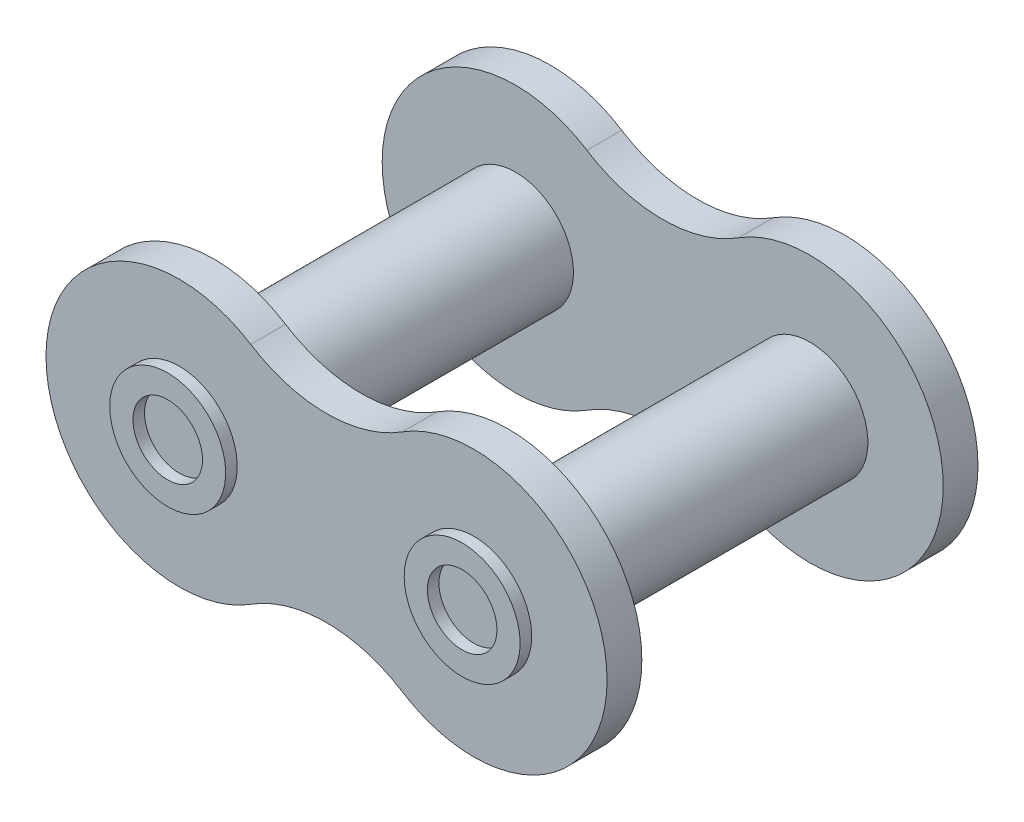
ISO-10303-21;
HEADER;
FILE_DESCRIPTION(('STEP AP214'),'2;1');
FILE_NAME('part.step','',(''),(''),'','','');
FILE_SCHEMA(('AUTOMOTIVE_DESIGN { 1 0 10303 214 1 1 1 1 }'));
ENDSEC;
DATA;
#1=APPLICATION_CONTEXT('core data for automotive mechanical design processes');
#2=APPLICATION_PROTOCOL_DEFINITION('international standard','automotive_design',2000,#1);
#3=PRODUCT_CONTEXT('',#1,'mechanical');
#4=PRODUCT('Part','Part','',(#3));
#5=PRODUCT_RELATED_PRODUCT_CATEGORY('part','',(#4));
#6=PRODUCT_DEFINITION_FORMATION('','',#4);
#7=PRODUCT_DEFINITION_CONTEXT('part definition',#1,'design');
#8=PRODUCT_DEFINITION('design','',#6,#7);
#9=PRODUCT_DEFINITION_SHAPE('','',#8);
#10=(LENGTH_UNIT() NAMED_UNIT(*) SI_UNIT(.MILLI.,.METRE.));
#11=(NAMED_UNIT(*) PLANE_ANGLE_UNIT() SI_UNIT($,.RADIAN.));
#12=(NAMED_UNIT(*) SI_UNIT($,.STERADIAN.) SOLID_ANGLE_UNIT());
#13=UNCERTAINTY_MEASURE_WITH_UNIT(LENGTH_MEASURE(1.E-05),#10,'distance_accuracy_value','');
#14=(GEOMETRIC_REPRESENTATION_CONTEXT(3) GLOBAL_UNCERTAINTY_ASSIGNED_CONTEXT((#13)) GLOBAL_UNIT_ASSIGNED_CONTEXT((#10,
#11,#12)) REPRESENTATION_CONTEXT('',''));
#15=CARTESIAN_POINT('',(0.,0.,0.));
#16=DIRECTION('',(0.,0.,1.));
#17=DIRECTION('',(1.,0.,0.));
#18=AXIS2_PLACEMENT_3D('',#15,#16,#17);
#19=CARTESIAN_POINT('',(3.175,5.,-8.));
#20=DIRECTION('',(0.,0.,1.));
#21=DIRECTION('',(1.,0.,0.));
#22=AXIS2_PLACEMENT_3D('',#19,#20,#21);
#23=PLANE('',#22);
#24=CARTESIAN_POINT('',(6.35,0.,-8.));
#25=DIRECTION('',(0.,0.,1.));
#26=DIRECTION('',(1.,0.,0.));
#27=AXIS2_PLACEMENT_3D('',#24,#25,#26);
#28=CIRCLE('',#27,2.5);
#29=CARTESIAN_POINT('',(8.85,0.,-8.));
#30=VERTEX_POINT('',#29);
#31=EDGE_CURVE('E271',#30,#30,#28,.T.);
#32=ORIENTED_EDGE('',*,*,#31,.T.);
#33=EDGE_LOOP('',(#32));
#34=FACE_BOUND('',#33,.T.);
#35=CARTESIAN_POINT('',(0.,10.,-8.));
#36=DIRECTION('',(0.,0.,1.));
#37=DIRECTION('',(1.,0.,0.));
#38=AXIS2_PLACEMENT_3D('',#35,#36,#37);
#39=CIRCLE('',#38,6.09577983925077);
#40=CARTESIAN_POINT('',(-3.26767865894177,4.85404935599722,-8.));
#41=VERTEX_POINT('',#40);
#42=CARTESIAN_POINT('',(3.26767865894177,4.85404935599722,-8.));
#43=VERTEX_POINT('',#42);
#44=EDGE_CURVE('E165',#41,#43,#39,.T.);
#45=ORIENTED_EDGE('',*,*,#44,.T.);
#46=CARTESIAN_POINT('',(6.35,0.,-8.));
#47=DIRECTION('',(0.,0.,-1.));
#48=DIRECTION('',(-1.,0.,0.));
#49=AXIS2_PLACEMENT_3D('',#46,#47,#48);
#50=CIRCLE('',#49,5.75);
#51=CARTESIAN_POINT('',(3.26767865894177,-4.85404935599722,-8.));
#52=VERTEX_POINT('',#51);
#53=EDGE_CURVE('E83',#43,#52,#50,.T.);
#54=ORIENTED_EDGE('',*,*,#53,.T.);
#55=CARTESIAN_POINT('',(0.,-10.,-8.));
#56=DIRECTION('',(0.,0.,-1.));
#57=DIRECTION('',(-1.,0.,0.));
#58=AXIS2_PLACEMENT_3D('',#55,#56,#57);
#59=CIRCLE('',#58,6.09577983925077);
#60=CARTESIAN_POINT('',(-3.26767865894177,-4.85404935599722,-8.));
#61=VERTEX_POINT('',#60);
#62=EDGE_CURVE('E169',#61,#52,#59,.T.);
#63=ORIENTED_EDGE('',*,*,#62,.F.);
#64=CARTESIAN_POINT('',(-6.35,0.,-8.));
#65=DIRECTION('',(0.,0.,1.));
#66=DIRECTION('',(1.,0.,0.));
#67=AXIS2_PLACEMENT_3D('',#64,#65,#66);
#68=CIRCLE('',#67,5.75);
#69=EDGE_CURVE('E172',#41,#61,#68,.T.);
#70=ORIENTED_EDGE('',*,*,#69,.F.);
#71=EDGE_LOOP('',(#45,#54,#63,#70));
#72=FACE_BOUND('',#71,.T.);
#73=CARTESIAN_POINT('',(-6.35,0.,-8.));
#74=DIRECTION('',(0.,0.,1.));
#75=DIRECTION('',(1.,0.,0.));
#76=AXIS2_PLACEMENT_3D('',#73,#74,#75);
#77=CIRCLE('',#76,2.5);
#78=CARTESIAN_POINT('',(-3.85,0.,-8.));
#79=VERTEX_POINT('',#78);
#80=EDGE_CURVE('E12',#79,#79,#77,.F.);
#81=ORIENTED_EDGE('',*,*,#80,.F.);
#82=EDGE_LOOP('',(#81));
#83=FACE_BOUND('',#82,.T.);
#84=ADVANCED_FACE('F38',(#34,#72,#83),#23,.F.);
#85=CARTESIAN_POINT('',(3.175,5.,8.));
#86=DIRECTION('',(0.,0.,-1.));
#87=DIRECTION('',(1.,0.,0.));
#88=AXIS2_PLACEMENT_3D('',#85,#86,#87);
#89=PLANE('',#88);
#90=CARTESIAN_POINT('',(6.35,0.,8.));
#91=DIRECTION('',(0.,0.,-1.));
#92=DIRECTION('',(-1.,0.,0.));
#93=AXIS2_PLACEMENT_3D('',#90,#91,#92);
#94=CIRCLE('',#93,2.5);
#95=CARTESIAN_POINT('',(3.85,0.,8.));
#96=VERTEX_POINT('',#95);
#97=EDGE_CURVE('E275',#96,#96,#94,.T.);
#98=ORIENTED_EDGE('',*,*,#97,.T.);
#99=EDGE_LOOP('',(#98));
#100=FACE_BOUND('',#99,.T.);
#101=CARTESIAN_POINT('',(0.,10.,8.));
#102=DIRECTION('',(0.,0.,1.));
#103=DIRECTION('',(1.,0.,0.));
#104=AXIS2_PLACEMENT_3D('',#101,#102,#103);
#105=CIRCLE('',#104,6.09577983925077);
#106=CARTESIAN_POINT('',(-3.26767865894177,4.85404935599722,8.));
#107=VERTEX_POINT('',#106);
#108=CARTESIAN_POINT('',(3.26767865894177,4.85404935599722,8.));
#109=VERTEX_POINT('',#108);
#110=EDGE_CURVE('E115',#107,#109,#105,.T.);
#111=ORIENTED_EDGE('',*,*,#110,.F.);
#112=CARTESIAN_POINT('',(-6.35,0.,8.));
#113=DIRECTION('',(0.,0.,1.));
#114=DIRECTION('',(1.,0.,0.));
#115=AXIS2_PLACEMENT_3D('',#112,#113,#114);
#116=CIRCLE('',#115,5.75);
#117=CARTESIAN_POINT('',(-3.26767865894177,-4.85404935599722,8.));
#118=VERTEX_POINT('',#117);
#119=EDGE_CURVE('E125',#107,#118,#116,.T.);
#120=ORIENTED_EDGE('',*,*,#119,.T.);
#121=CARTESIAN_POINT('',(0.,-10.,8.));
#122=DIRECTION('',(0.,0.,-1.));
#123=DIRECTION('',(-1.,0.,0.));
#124=AXIS2_PLACEMENT_3D('',#121,#122,#123);
#125=CIRCLE('',#124,6.09577983925077);
#126=CARTESIAN_POINT('',(3.26767865894177,-4.85404935599722,8.));
#127=VERTEX_POINT('',#126);
#128=EDGE_CURVE('E130',#118,#127,#125,.T.);
#129=ORIENTED_EDGE('',*,*,#128,.T.);
#130=CARTESIAN_POINT('',(6.35,0.,8.));
#131=DIRECTION('',(0.,0.,-1.));
#132=DIRECTION('',(-1.,0.,0.));
#133=AXIS2_PLACEMENT_3D('',#130,#131,#132);
#134=CIRCLE('',#133,5.75);
#135=EDGE_CURVE('E135',#109,#127,#134,.T.);
#136=ORIENTED_EDGE('',*,*,#135,.F.);
#137=EDGE_LOOP('',(#111,#120,#129,#136));
#138=FACE_BOUND('',#137,.T.);
#139=CARTESIAN_POINT('',(-6.35,0.,8.));
#140=DIRECTION('',(0.,0.,-1.));
#141=DIRECTION('',(-1.,0.,0.));
#142=AXIS2_PLACEMENT_3D('',#139,#140,#141);
#143=CIRCLE('',#142,2.5);
#144=CARTESIAN_POINT('',(-8.85,0.,8.));
#145=VERTEX_POINT('',#144);
#146=EDGE_CURVE('E42',#145,#145,#143,.F.);
#147=ORIENTED_EDGE('',*,*,#146,.F.);
#148=EDGE_LOOP('',(#147));
#149=FACE_BOUND('',#148,.T.);
#150=ADVANCED_FACE('F132',(#100,#138,#149),#89,.F.);
#151=CARTESIAN_POINT('',(3.175,5.,-6.5));
#152=DIRECTION('',(0.,0.,1.));
#153=DIRECTION('',(1.,0.,0.));
#154=AXIS2_PLACEMENT_3D('',#151,#152,#153);
#155=PLANE('',#154);
#156=CARTESIAN_POINT('',(0.,10.,-6.5));
#157=DIRECTION('',(0.,0.,1.));
#158=DIRECTION('',(1.,0.,0.));
#159=AXIS2_PLACEMENT_3D('',#156,#157,#158);
#160=CIRCLE('',#159,6.09577983925077);
#161=CARTESIAN_POINT('',(-3.26767865894177,4.85404935599722,-6.5));
#162=VERTEX_POINT('',#161);
#163=CARTESIAN_POINT('',(3.26767865894177,4.85404935599722,-6.5));
#164=VERTEX_POINT('',#163);
#165=EDGE_CURVE('E162',#162,#164,#160,.T.);
#166=ORIENTED_EDGE('',*,*,#165,.F.);
#167=CARTESIAN_POINT('',(-6.35,0.,-6.5));
#168=DIRECTION('',(0.,0.,1.));
#169=DIRECTION('',(1.,0.,0.));
#170=AXIS2_PLACEMENT_3D('',#167,#168,#169);
#171=CIRCLE('',#170,5.75);
#172=CARTESIAN_POINT('',(-3.26767865894177,-4.85404935599722,-6.5));
#173=VERTEX_POINT('',#172);
#174=EDGE_CURVE('E167',#162,#173,#171,.T.);
#175=ORIENTED_EDGE('',*,*,#174,.T.);
#176=CARTESIAN_POINT('',(0.,-10.,-6.5));
#177=DIRECTION('',(0.,0.,-1.));
#178=DIRECTION('',(-1.,0.,0.));
#179=AXIS2_PLACEMENT_3D('',#176,#177,#178);
#180=CIRCLE('',#179,6.09577983925077);
#181=CARTESIAN_POINT('',(3.26767865894177,-4.85404935599722,-6.5));
#182=VERTEX_POINT('',#181);
#183=EDGE_CURVE('E178',#173,#182,#180,.T.);
#184=ORIENTED_EDGE('',*,*,#183,.T.);
#185=CARTESIAN_POINT('',(6.35,0.,-6.5));
#186=DIRECTION('',(0.,0.,-1.));
#187=DIRECTION('',(-1.,0.,0.));
#188=AXIS2_PLACEMENT_3D('',#185,#186,#187);
#189=CIRCLE('',#188,5.75);
#190=EDGE_CURVE('E175',#164,#182,#189,.T.);
#191=ORIENTED_EDGE('',*,*,#190,.F.);
#192=EDGE_LOOP('',(#166,#175,#184,#191));
#193=FACE_BOUND('',#192,.T.);
#194=CARTESIAN_POINT('',(6.35,0.,-6.5));
#195=DIRECTION('',(0.,0.,1.));
#196=DIRECTION('',(1.,0.,0.));
#197=AXIS2_PLACEMENT_3D('',#194,#195,#196);
#198=CIRCLE('',#197,2.5);
#199=CARTESIAN_POINT('',(3.85,0.,-6.5));
#200=VERTEX_POINT('',#199);
#201=EDGE_CURVE('E188',#200,#200,#198,.F.);
#202=ORIENTED_EDGE('',*,*,#201,.T.);
#203=EDGE_LOOP('',(#202));
#204=FACE_BOUND('',#203,.T.);
#205=CARTESIAN_POINT('',(-6.35,0.,-6.5));
#206=DIRECTION('',(0.,0.,1.));
#207=DIRECTION('',(1.,0.,0.));
#208=AXIS2_PLACEMENT_3D('',#205,#206,#207);
#209=CIRCLE('',#208,2.5);
#210=CARTESIAN_POINT('',(-8.85,0.,-6.5));
#211=VERTEX_POINT('',#210);
#212=EDGE_CURVE('E159',#211,#211,#209,.T.);
#213=ORIENTED_EDGE('',*,*,#212,.F.);
#214=EDGE_LOOP('',(#213));
#215=FACE_BOUND('',#214,.T.);
#216=ADVANCED_FACE('F197',(#193,#204,#215),#155,.T.);
#217=CARTESIAN_POINT('',(6.35,0.,6.5));
#218=DIRECTION('',(0.,0.,-1.));
#219=DIRECTION('',(-1.,0.,0.));
#220=AXIS2_PLACEMENT_3D('',#217,#218,#219);
#221=CYLINDRICAL_SURFACE('',#220,2.5);
#222=CARTESIAN_POINT('',(6.35,0.,6.5));
#223=DIRECTION('',(0.,0.,-1.));
#224=DIRECTION('',(-1.,0.,0.));
#225=AXIS2_PLACEMENT_3D('',#222,#223,#224);
#226=CIRCLE('',#225,2.5);
#227=CARTESIAN_POINT('',(3.85,0.,6.5));
#228=VERTEX_POINT('',#227);
#229=EDGE_CURVE('E121',#228,#228,#226,.F.);
#230=CARTESIAN_POINT('',(3.85,0.,6.5));
#231=CARTESIAN_POINT('',(3.85,0.,6.36458333333333));
#232=CARTESIAN_POINT('',(3.85,0.,6.22916666666667));
#233=CARTESIAN_POINT('',(3.85,0.,5.95833333333333));
#234=CARTESIAN_POINT('',(3.85,0.,5.82291666666667));
#235=CARTESIAN_POINT('',(3.85,0.,5.55208333333333));
#236=CARTESIAN_POINT('',(3.85,0.,5.41666666666667));
#237=CARTESIAN_POINT('',(3.85,0.,5.14583333333333));
#238=CARTESIAN_POINT('',(3.85,0.,5.01041666666667));
#239=CARTESIAN_POINT('',(3.85,0.,4.73958333333333));
#240=CARTESIAN_POINT('',(3.85,0.,4.60416666666667));
#241=CARTESIAN_POINT('',(3.85,0.,4.33333333333333));
#242=CARTESIAN_POINT('',(3.85,0.,4.19791666666667));
#243=CARTESIAN_POINT('',(3.85,0.,3.92708333333333));
#244=CARTESIAN_POINT('',(3.85,0.,3.79166666666667));
#245=CARTESIAN_POINT('',(3.85,0.,3.52083333333333));
#246=CARTESIAN_POINT('',(3.85,0.,3.38541666666667));
#247=CARTESIAN_POINT('',(3.85,0.,3.11458333333333));
#248=CARTESIAN_POINT('',(3.85,0.,2.97916666666667));
#249=CARTESIAN_POINT('',(3.85,0.,2.70833333333333));
#250=CARTESIAN_POINT('',(3.85,0.,2.57291666666667));
#251=CARTESIAN_POINT('',(3.85,0.,2.30208333333333));
#252=CARTESIAN_POINT('',(3.85,0.,2.16666666666667));
#253=CARTESIAN_POINT('',(3.85,0.,1.89583333333333));
#254=CARTESIAN_POINT('',(3.85,0.,1.76041666666667));
#255=CARTESIAN_POINT('',(3.85,0.,1.48958333333333));
#256=CARTESIAN_POINT('',(3.85,0.,1.35416666666667));
#257=CARTESIAN_POINT('',(3.85,0.,1.08333333333333));
#258=CARTESIAN_POINT('',(3.85,0.,0.947916666666668));
#259=CARTESIAN_POINT('',(3.85,0.,0.677083333333334));
#260=CARTESIAN_POINT('',(3.85,0.,0.541666666666668));
#261=CARTESIAN_POINT('',(3.85,0.,0.270833333333334));
#262=CARTESIAN_POINT('',(3.85,0.,0.135416666666668));
#263=CARTESIAN_POINT('',(3.85,0.,-0.135416666666666));
#264=CARTESIAN_POINT('',(3.85,0.,-0.270833333333333));
#265=CARTESIAN_POINT('',(3.85,0.,-0.541666666666666));
#266=CARTESIAN_POINT('',(3.85,0.,-0.677083333333332));
#267=CARTESIAN_POINT('',(3.85,0.,-0.947916666666666));
#268=CARTESIAN_POINT('',(3.85,0.,-1.08333333333333));
#269=CARTESIAN_POINT('',(3.85,0.,-1.35416666666667));
#270=CARTESIAN_POINT('',(3.85,0.,-1.48958333333333));
#271=CARTESIAN_POINT('',(3.85,0.,-1.76041666666667));
#272=CARTESIAN_POINT('',(3.85,0.,-1.89583333333333));
#273=CARTESIAN_POINT('',(3.85,0.,-2.16666666666667));
#274=CARTESIAN_POINT('',(3.85,0.,-2.30208333333333));
#275=CARTESIAN_POINT('',(3.85,0.,-2.57291666666667));
#276=CARTESIAN_POINT('',(3.85,0.,-2.70833333333333));
#277=CARTESIAN_POINT('',(3.85,0.,-2.97916666666667));
#278=CARTESIAN_POINT('',(3.85,0.,-3.11458333333333));
#279=CARTESIAN_POINT('',(3.85,0.,-3.38541666666667));
#280=CARTESIAN_POINT('',(3.85,0.,-3.52083333333333));
#281=CARTESIAN_POINT('',(3.85,0.,-3.79166666666667));
#282=CARTESIAN_POINT('',(3.85,0.,-3.92708333333333));
#283=CARTESIAN_POINT('',(3.85,0.,-4.19791666666667));
#284=CARTESIAN_POINT('',(3.85,0.,-4.33333333333333));
#285=CARTESIAN_POINT('',(3.85,0.,-4.60416666666667));
#286=CARTESIAN_POINT('',(3.85,0.,-4.73958333333333));
#287=CARTESIAN_POINT('',(3.85,0.,-5.01041666666667));
#288=CARTESIAN_POINT('',(3.85,0.,-5.14583333333333));
#289=CARTESIAN_POINT('',(3.85,0.,-5.41666666666667));
#290=CARTESIAN_POINT('',(3.85,0.,-5.55208333333333));
#291=CARTESIAN_POINT('',(3.85,0.,-5.82291666666667));
#292=CARTESIAN_POINT('',(3.85,0.,-5.95833333333333));
#293=CARTESIAN_POINT('',(3.85,0.,-6.22916666666667));
#294=CARTESIAN_POINT('',(3.85,0.,-6.36458333333333));
#295=CARTESIAN_POINT('',(3.85,0.,-6.5));
#296=B_SPLINE_CURVE_WITH_KNOTS('',3,(#230,#231,#232,#233,#234,#235,#236,#237,#238,#239,#240,
#241,#242,#243,#244,#245,#246,#247,#248,#249,#250,#251,#252,#253,#254,#255,#256,#257,#258,#259,
#260,#261,#262,#263,#264,#265,#266,#267,#268,#269,#270,#271,#272,#273,#274,#275,#276,#277,#278,
#279,#280,#281,#282,#283,#284,#285,#286,#287,#288,#289,#290,#291,#292,#293,#294,#295),
.UNSPECIFIED.,.F.,.F.,(4,2,2,2,2,2,2,2,2,2,2,2,2,2,2,2,2,2,2,2,2,2,2,2,2,2,2,2,2,2,2,2,4),(0.,
0.40625,0.812500000000001,1.21875,1.625,2.03125,2.4375,2.84375,3.25,3.65625,4.0625,4.46875,
4.875,5.28125,5.6875,6.09375,6.5,6.90625,7.3125,7.71875,8.125,8.53125,8.9375,9.34375,9.75,
10.15625,10.5625,10.96875,11.375,11.78125,12.1875,12.59375,13.),.UNSPECIFIED.);
#297=EDGE_CURVE('BSEAM40',#228,#200,#296,.T.);
#298=ORIENTED_EDGE('',*,*,#229,.F.);
#299=ORIENTED_EDGE('',*,*,#201,.F.);
#300=ORIENTED_EDGE('',*,*,#297,.T.);
#301=ORIENTED_EDGE('',*,*,#297,.F.);
#302=EDGE_LOOP('',(#298,#300,#299,#301));
#303=FACE_BOUND('',#302,.T.);
#304=ADVANCED_FACE('F40',(#303),#221,.T.);
#305=CARTESIAN_POINT('',(0.,10.,-8.));
#306=DIRECTION('',(0.,0.,1.));
#307=DIRECTION('',(1.,0.,0.));
#308=AXIS2_PLACEMENT_3D('',#305,#306,#307);
#309=CYLINDRICAL_SURFACE('',#308,6.09577983925077);
#310=ORIENTED_EDGE('',*,*,#165,.T.);
#311=DIRECTION('',(0.,0.,1.));
#312=VECTOR('',#311,1.);
#313=CARTESIAN_POINT('',(3.26767865894177,4.85404935599722,-8.));
#314=LINE('',#313,#312);
#315=EDGE_CURVE('E187',#43,#164,#314,.T.);
#316=ORIENTED_EDGE('',*,*,#315,.F.);
#317=ORIENTED_EDGE('',*,*,#44,.F.);
#318=DIRECTION('',(0.,0.,1.));
#319=VECTOR('',#318,1.);
#320=CARTESIAN_POINT('',(-3.26767865894177,4.85404935599722,-8.));
#321=LINE('',#320,#319);
#322=EDGE_CURVE('E56',#41,#162,#321,.T.);
#323=ORIENTED_EDGE('',*,*,#322,.T.);
#324=EDGE_LOOP('',(#310,#316,#317,#323));
#325=FACE_BOUND('',#324,.T.);
#326=ADVANCED_FACE('F243',(#325),#309,.F.);
#327=CARTESIAN_POINT('',(6.35,0.,-8.));
#328=DIRECTION('',(0.,0.,1.));
#329=DIRECTION('',(1.,0.,0.));
#330=AXIS2_PLACEMENT_3D('',#327,#328,#329);
#331=CYLINDRICAL_SURFACE('',#330,5.75);
#332=ORIENTED_EDGE('',*,*,#190,.T.);
#333=DIRECTION('',(0.,0.,1.));
#334=VECTOR('',#333,1.);
#335=CARTESIAN_POINT('',(3.26767865894177,-4.85404935599722,-8.));
#336=LINE('',#335,#334);
#337=EDGE_CURVE('E185',#52,#182,#336,.T.);
#338=ORIENTED_EDGE('',*,*,#337,.F.);
#339=ORIENTED_EDGE('',*,*,#53,.F.);
#340=ORIENTED_EDGE('',*,*,#315,.T.);
#341=EDGE_LOOP('',(#332,#338,#339,#340));
#342=FACE_BOUND('',#341,.T.);
#343=ADVANCED_FACE('F240',(#342),#331,.T.);
#344=CARTESIAN_POINT('',(0.,-10.,-8.));
#345=DIRECTION('',(0.,0.,1.));
#346=DIRECTION('',(1.,0.,0.));
#347=AXIS2_PLACEMENT_3D('',#344,#345,#346);
#348=CYLINDRICAL_SURFACE('',#347,6.09577983925077);
#349=ORIENTED_EDGE('',*,*,#183,.F.);
#350=DIRECTION('',(0.,0.,1.));
#351=VECTOR('',#350,1.);
#352=CARTESIAN_POINT('',(-3.26767865894177,-4.85404935599722,-8.));
#353=LINE('',#352,#351);
#354=EDGE_CURVE('E71',#61,#173,#353,.T.);
#355=ORIENTED_EDGE('',*,*,#354,.F.);
#356=ORIENTED_EDGE('',*,*,#62,.T.);
#357=ORIENTED_EDGE('',*,*,#337,.T.);
#358=EDGE_LOOP('',(#349,#355,#356,#357));
#359=FACE_BOUND('',#358,.T.);
#360=ADVANCED_FACE('F237',(#359),#348,.F.);
#361=CARTESIAN_POINT('',(-6.35,0.,-8.));
#362=DIRECTION('',(0.,0.,1.));
#363=DIRECTION('',(1.,0.,0.));
#364=AXIS2_PLACEMENT_3D('',#361,#362,#363);
#365=CYLINDRICAL_SURFACE('',#364,5.75);
#366=ORIENTED_EDGE('',*,*,#174,.F.);
#367=ORIENTED_EDGE('',*,*,#322,.F.);
#368=ORIENTED_EDGE('',*,*,#69,.T.);
#369=ORIENTED_EDGE('',*,*,#354,.T.);
#370=EDGE_LOOP('',(#366,#367,#368,#369));
#371=FACE_BOUND('',#370,.T.);
#372=ADVANCED_FACE('F232',(#371),#365,.T.);
#373=CARTESIAN_POINT('',(-6.35,0.,6.5));
#374=DIRECTION('',(0.,0.,-1.));
#375=DIRECTION('',(-1.,0.,0.));
#376=AXIS2_PLACEMENT_3D('',#373,#374,#375);
#377=CYLINDRICAL_SURFACE('',#376,2.5);
#378=CARTESIAN_POINT('',(-6.35,0.,6.5));
#379=DIRECTION('',(0.,0.,1.));
#380=DIRECTION('',(1.,0.,0.));
#381=AXIS2_PLACEMENT_3D('',#378,#379,#380);
#382=CIRCLE('',#381,2.5);
#383=CARTESIAN_POINT('',(-8.85,0.,6.5));
#384=VERTEX_POINT('',#383);
#385=EDGE_CURVE('E158',#384,#384,#382,.T.);
#386=CARTESIAN_POINT('',(-8.85,0.,6.5));
#387=CARTESIAN_POINT('',(-8.85,0.,6.36458333333333));
#388=CARTESIAN_POINT('',(-8.85,0.,6.22916666666667));
#389=CARTESIAN_POINT('',(-8.85,0.,5.95833333333333));
#390=CARTESIAN_POINT('',(-8.85,0.,5.82291666666667));
#391=CARTESIAN_POINT('',(-8.85,0.,5.55208333333333));
#392=CARTESIAN_POINT('',(-8.85,0.,5.41666666666667));
#393=CARTESIAN_POINT('',(-8.85,0.,5.14583333333333));
#394=CARTESIAN_POINT('',(-8.85,0.,5.01041666666667));
#395=CARTESIAN_POINT('',(-8.85,0.,4.73958333333333));
#396=CARTESIAN_POINT('',(-8.85,0.,4.60416666666667));
#397=CARTESIAN_POINT('',(-8.85,0.,4.33333333333333));
#398=CARTESIAN_POINT('',(-8.85,0.,4.19791666666667));
#399=CARTESIAN_POINT('',(-8.85,0.,3.92708333333333));
#400=CARTESIAN_POINT('',(-8.85,0.,3.79166666666667));
#401=CARTESIAN_POINT('',(-8.85,0.,3.52083333333333));
#402=CARTESIAN_POINT('',(-8.85,0.,3.38541666666667));
#403=CARTESIAN_POINT('',(-8.85,0.,3.11458333333333));
#404=CARTESIAN_POINT('',(-8.85,0.,2.97916666666667));
#405=CARTESIAN_POINT('',(-8.85,0.,2.70833333333333));
#406=CARTESIAN_POINT('',(-8.85,0.,2.57291666666667));
#407=CARTESIAN_POINT('',(-8.85,0.,2.30208333333333));
#408=CARTESIAN_POINT('',(-8.85,0.,2.16666666666667));
#409=CARTESIAN_POINT('',(-8.85,0.,1.89583333333333));
#410=CARTESIAN_POINT('',(-8.85,0.,1.76041666666667));
#411=CARTESIAN_POINT('',(-8.85,0.,1.48958333333333));
#412=CARTESIAN_POINT('',(-8.85,0.,1.35416666666667));
#413=CARTESIAN_POINT('',(-8.85,0.,1.08333333333333));
#414=CARTESIAN_POINT('',(-8.85,0.,0.947916666666666));
#415=CARTESIAN_POINT('',(-8.85,0.,0.677083333333332));
#416=CARTESIAN_POINT('',(-8.85,0.,0.541666666666666));
#417=CARTESIAN_POINT('',(-8.85,0.,0.270833333333333));
#418=CARTESIAN_POINT('',(-8.85,0.,0.135416666666666));
#419=CARTESIAN_POINT('',(-8.85,0.,-0.135416666666668));
#420=CARTESIAN_POINT('',(-8.85,0.,-0.270833333333334));
#421=CARTESIAN_POINT('',(-8.85,0.,-0.541666666666668));
#422=CARTESIAN_POINT('',(-8.85,0.,-0.677083333333334));
#423=CARTESIAN_POINT('',(-8.85,0.,-0.947916666666667));
#424=CARTESIAN_POINT('',(-8.85,0.,-1.08333333333333));
#425=CARTESIAN_POINT('',(-8.85,0.,-1.35416666666667));
#426=CARTESIAN_POINT('',(-8.85,0.,-1.48958333333333));
#427=CARTESIAN_POINT('',(-8.85,0.,-1.76041666666667));
#428=CARTESIAN_POINT('',(-8.85,0.,-1.89583333333333));
#429=CARTESIAN_POINT('',(-8.85,0.,-2.16666666666667));
#430=CARTESIAN_POINT('',(-8.85,0.,-2.30208333333333));
#431=CARTESIAN_POINT('',(-8.85,0.,-2.57291666666667));
#432=CARTESIAN_POINT('',(-8.85,0.,-2.70833333333333));
#433=CARTESIAN_POINT('',(-8.85,0.,-2.97916666666667));
#434=CARTESIAN_POINT('',(-8.85,0.,-3.11458333333333));
#435=CARTESIAN_POINT('',(-8.85,0.,-3.38541666666667));
#436=CARTESIAN_POINT('',(-8.85,0.,-3.52083333333333));
#437=CARTESIAN_POINT('',(-8.85,0.,-3.79166666666667));
#438=CARTESIAN_POINT('',(-8.85,0.,-3.92708333333333));
#439=CARTESIAN_POINT('',(-8.85,0.,-4.19791666666667));
#440=CARTESIAN_POINT('',(-8.85,0.,-4.33333333333333));
#441=CARTESIAN_POINT('',(-8.85,0.,-4.60416666666667));
#442=CARTESIAN_POINT('',(-8.85,0.,-4.73958333333333));
#443=CARTESIAN_POINT('',(-8.85,0.,-5.01041666666667));
#444=CARTESIAN_POINT('',(-8.85,0.,-5.14583333333333));
#445=CARTESIAN_POINT('',(-8.85,0.,-5.41666666666667));
#446=CARTESIAN_POINT('',(-8.85,0.,-5.55208333333333));
#447=CARTESIAN_POINT('',(-8.85,0.,-5.82291666666667));
#448=CARTESIAN_POINT('',(-8.85,0.,-5.95833333333333));
#449=CARTESIAN_POINT('',(-8.85,0.,-6.22916666666667));
#450=CARTESIAN_POINT('',(-8.85,0.,-6.36458333333333));
#451=CARTESIAN_POINT('',(-8.85,0.,-6.5));
#452=B_SPLINE_CURVE_WITH_KNOTS('',3,(#386,#387,#388,#389,#390,#391,#392,#393,#394,#395,#396,
#397,#398,#399,#400,#401,#402,#403,#404,#405,#406,#407,#408,#409,#410,#411,#412,#413,#414,#415,
#416,#417,#418,#419,#420,#421,#422,#423,#424,#425,#426,#427,#428,#429,#430,#431,#432,#433,#434,
#435,#436,#437,#438,#439,#440,#441,#442,#443,#444,#445,#446,#447,#448,#449,#450,#451),
.UNSPECIFIED.,.F.,.F.,(4,2,2,2,2,2,2,2,2,2,2,2,2,2,2,2,2,2,2,2,2,2,2,2,2,2,2,2,2,2,2,2,4),(0.,
0.40625,0.8125,1.21875,1.625,2.03125,2.4375,2.84375,3.25,3.65625,4.0625,4.46875,4.875,5.28125,
5.6875,6.09375,6.5,6.90625,7.3125,7.71875,8.125,8.53125,8.9375,9.34375,9.75,10.15625,10.5625,
10.96875,11.375,11.78125,12.1875,12.59375,13.),.UNSPECIFIED.);
#453=EDGE_CURVE('BSEAM216',#384,#211,#452,.T.);
#454=ORIENTED_EDGE('',*,*,#385,.F.);
#455=ORIENTED_EDGE('',*,*,#212,.T.);
#456=ORIENTED_EDGE('',*,*,#453,.T.);
#457=ORIENTED_EDGE('',*,*,#453,.F.);
#458=EDGE_LOOP('',(#454,#456,#455,#457));
#459=FACE_BOUND('',#458,.T.);
#460=ADVANCED_FACE('F216',(#459),#377,.T.);
#461=CARTESIAN_POINT('',(3.175,5.,6.5));
#462=DIRECTION('',(0.,0.,-1.));
#463=DIRECTION('',(1.,0.,0.));
#464=AXIS2_PLACEMENT_3D('',#461,#462,#463);
#465=PLANE('',#464);
#466=ORIENTED_EDGE('',*,*,#229,.T.);
#467=EDGE_LOOP('',(#466));
#468=FACE_BOUND('',#467,.T.);
#469=CARTESIAN_POINT('',(0.,10.,6.5));
#470=DIRECTION('',(0.,0.,1.));
#471=DIRECTION('',(1.,0.,0.));
#472=AXIS2_PLACEMENT_3D('',#469,#470,#471);
#473=CIRCLE('',#472,6.09577983925077);
#474=CARTESIAN_POINT('',(-3.26767865894177,4.85404935599722,6.5));
#475=VERTEX_POINT('',#474);
#476=CARTESIAN_POINT('',(3.26767865894177,4.85404935599722,6.5));
#477=VERTEX_POINT('',#476);
#478=EDGE_CURVE('E118',#475,#477,#473,.T.);
#479=ORIENTED_EDGE('',*,*,#478,.T.);
#480=CARTESIAN_POINT('',(6.35,0.,6.5));
#481=DIRECTION('',(0.,0.,-1.));
#482=DIRECTION('',(-1.,0.,0.));
#483=AXIS2_PLACEMENT_3D('',#480,#481,#482);
#484=CIRCLE('',#483,5.75);
#485=CARTESIAN_POINT('',(3.26767865894177,-4.85404935599722,6.5));
#486=VERTEX_POINT('',#485);
#487=EDGE_CURVE('E136',#477,#486,#484,.T.);
#488=ORIENTED_EDGE('',*,*,#487,.T.);
#489=CARTESIAN_POINT('',(0.,-10.,6.5));
#490=DIRECTION('',(0.,0.,-1.));
#491=DIRECTION('',(-1.,0.,0.));
#492=AXIS2_PLACEMENT_3D('',#489,#490,#491);
#493=CIRCLE('',#492,6.09577983925077);
#494=CARTESIAN_POINT('',(-3.26767865894177,-4.85404935599722,6.5));
#495=VERTEX_POINT('',#494);
#496=EDGE_CURVE('E139',#495,#486,#493,.T.);
#497=ORIENTED_EDGE('',*,*,#496,.F.);
#498=CARTESIAN_POINT('',(-6.35,0.,6.5));
#499=DIRECTION('',(0.,0.,1.));
#500=DIRECTION('',(1.,0.,0.));
#501=AXIS2_PLACEMENT_3D('',#498,#499,#500);
#502=CIRCLE('',#501,5.75);
#503=EDGE_CURVE('E147',#475,#495,#502,.T.);
#504=ORIENTED_EDGE('',*,*,#503,.F.);
#505=EDGE_LOOP('',(#479,#488,#497,#504));
#506=FACE_BOUND('',#505,.T.);
#507=ORIENTED_EDGE('',*,*,#385,.T.);
#508=EDGE_LOOP('',(#507));
#509=FACE_BOUND('',#508,.T.);
#510=ADVANCED_FACE('F213',(#468,#506,#509),#465,.T.);
#511=CARTESIAN_POINT('',(0.,10.,8.));
#512=DIRECTION('',(0.,0.,-1.));
#513=DIRECTION('',(-1.,0.,0.));
#514=AXIS2_PLACEMENT_3D('',#511,#512,#513);
#515=CYLINDRICAL_SURFACE('',#514,6.09577983925077);
#516=ORIENTED_EDGE('',*,*,#478,.F.);
#517=DIRECTION('',(0.,0.,-1.));
#518=VECTOR('',#517,1.);
#519=CARTESIAN_POINT('',(-3.26767865894177,4.85404935599722,8.));
#520=LINE('',#519,#518);
#521=EDGE_CURVE('E111',#107,#475,#520,.T.);
#522=ORIENTED_EDGE('',*,*,#521,.F.);
#523=ORIENTED_EDGE('',*,*,#110,.T.);
#524=DIRECTION('',(0.,0.,-1.));
#525=VECTOR('',#524,1.);
#526=CARTESIAN_POINT('',(3.26767865894177,4.85404935599722,8.));
#527=LINE('',#526,#525);
#528=EDGE_CURVE('E145',#109,#477,#527,.T.);
#529=ORIENTED_EDGE('',*,*,#528,.T.);
#530=EDGE_LOOP('',(#516,#522,#523,#529));
#531=FACE_BOUND('',#530,.T.);
#532=ADVANCED_FACE('F113',(#531),#515,.F.);
#533=CARTESIAN_POINT('',(-6.35,0.,8.));
#534=DIRECTION('',(0.,0.,-1.));
#535=DIRECTION('',(-1.,0.,0.));
#536=AXIS2_PLACEMENT_3D('',#533,#534,#535);
#537=CYLINDRICAL_SURFACE('',#536,5.75);
#538=ORIENTED_EDGE('',*,*,#503,.T.);
#539=DIRECTION('',(0.,0.,-1.));
#540=VECTOR('',#539,1.);
#541=CARTESIAN_POINT('',(-3.26767865894177,-4.85404935599722,8.));
#542=LINE('',#541,#540);
#543=EDGE_CURVE('E122',#118,#495,#542,.T.);
#544=ORIENTED_EDGE('',*,*,#543,.F.);
#545=ORIENTED_EDGE('',*,*,#119,.F.);
#546=ORIENTED_EDGE('',*,*,#521,.T.);
#547=EDGE_LOOP('',(#538,#544,#545,#546));
#548=FACE_BOUND('',#547,.T.);
#549=ADVANCED_FACE('F126',(#548),#537,.T.);
#550=CARTESIAN_POINT('',(0.,-10.,8.));
#551=DIRECTION('',(0.,0.,-1.));
#552=DIRECTION('',(-1.,0.,0.));
#553=AXIS2_PLACEMENT_3D('',#550,#551,#552);
#554=CYLINDRICAL_SURFACE('',#553,6.09577983925077);
#555=ORIENTED_EDGE('',*,*,#496,.T.);
#556=DIRECTION('',(0.,0.,-1.));
#557=VECTOR('',#556,1.);
#558=CARTESIAN_POINT('',(3.26767865894177,-4.85404935599722,8.));
#559=LINE('',#558,#557);
#560=EDGE_CURVE('E153',#127,#486,#559,.T.);
#561=ORIENTED_EDGE('',*,*,#560,.F.);
#562=ORIENTED_EDGE('',*,*,#128,.F.);
#563=ORIENTED_EDGE('',*,*,#543,.T.);
#564=EDGE_LOOP('',(#555,#561,#562,#563));
#565=FACE_BOUND('',#564,.T.);
#566=ADVANCED_FACE('F222',(#565),#554,.F.);
#567=CARTESIAN_POINT('',(6.35,0.,8.));
#568=DIRECTION('',(0.,0.,-1.));
#569=DIRECTION('',(-1.,0.,0.));
#570=AXIS2_PLACEMENT_3D('',#567,#568,#569);
#571=CYLINDRICAL_SURFACE('',#570,5.75);
#572=ORIENTED_EDGE('',*,*,#487,.F.);
#573=ORIENTED_EDGE('',*,*,#528,.F.);
#574=ORIENTED_EDGE('',*,*,#135,.T.);
#575=ORIENTED_EDGE('',*,*,#560,.T.);
#576=EDGE_LOOP('',(#572,#573,#574,#575));
#577=FACE_BOUND('',#576,.T.);
#578=ADVANCED_FACE('F218',(#577),#571,.T.);
#579=CARTESIAN_POINT('',(3.175,5.,8.5));
#580=DIRECTION('',(0.,0.,-1.));
#581=DIRECTION('',(1.,0.,0.));
#582=AXIS2_PLACEMENT_3D('',#579,#580,#581);
#583=PLANE('',#582);
#584=CARTESIAN_POINT('',(-6.35,0.,8.5));
#585=DIRECTION('',(0.,0.,1.));
#586=DIRECTION('',(1.,0.,0.));
#587=AXIS2_PLACEMENT_3D('',#584,#585,#586);
#588=CIRCLE('',#587,1.5);
#589=CARTESIAN_POINT('',(-4.85,0.,8.5));
#590=VERTEX_POINT('',#589);
#591=EDGE_CURVE('E288',#590,#590,#588,.T.);
#592=ORIENTED_EDGE('',*,*,#591,.F.);
#593=EDGE_LOOP('',(#592));
#594=FACE_BOUND('',#593,.T.);
#595=CARTESIAN_POINT('',(-6.35,0.,8.5));
#596=DIRECTION('',(0.,0.,-1.));
#597=DIRECTION('',(-1.,0.,0.));
#598=AXIS2_PLACEMENT_3D('',#595,#596,#597);
#599=CIRCLE('',#598,2.5);
#600=CARTESIAN_POINT('',(-8.85,0.,8.5));
#601=VERTEX_POINT('',#600);
#602=EDGE_CURVE('E148',#601,#601,#599,.T.);
#603=ORIENTED_EDGE('',*,*,#602,.F.);
#604=EDGE_LOOP('',(#603));
#605=FACE_BOUND('',#604,.T.);
#606=ADVANCED_FACE('F221',(#594,#605),#583,.F.);
#607=CARTESIAN_POINT('',(-6.35,0.,16.0710678118655));
#608=DIRECTION('',(0.,0.,-1.));
#609=DIRECTION('',(-1.,0.,0.));
#610=AXIS2_PLACEMENT_3D('',#607,#608,#609);
#611=CYLINDRICAL_SURFACE('',#610,2.5);
#612=ORIENTED_EDGE('',*,*,#602,.T.);
#613=EDGE_LOOP('',(#612));
#614=FACE_BOUND('',#613,.T.);
#615=ORIENTED_EDGE('',*,*,#146,.T.);
#616=EDGE_LOOP('',(#615));
#617=FACE_BOUND('',#616,.T.);
#618=ADVANCED_FACE('F195',(#614,#617),#611,.T.);
#619=CARTESIAN_POINT('',(-6.35,0.,-8.5));
#620=DIRECTION('',(0.,0.,1.));
#621=DIRECTION('',(1.,0.,0.));
#622=AXIS2_PLACEMENT_3D('',#619,#620,#621);
#623=CIRCLE('',#622,2.5);
#624=CARTESIAN_POINT('',(-3.85,0.,-8.5));
#625=VERTEX_POINT('',#624);
#626=EDGE_CURVE('E269',#625,#625,#623,.F.);
#627=ORIENTED_EDGE('',*,*,#626,.F.);
#628=EDGE_LOOP('',(#627));
#629=FACE_BOUND('',#628,.T.);
#630=ORIENTED_EDGE('',*,*,#80,.T.);
#631=EDGE_LOOP('',(#630));
#632=FACE_BOUND('',#631,.T.);
#633=ADVANCED_FACE('F211',(#629,#632),#611,.T.);
#634=CARTESIAN_POINT('',(3.175,5.,-8.5));
#635=DIRECTION('',(0.,0.,1.));
#636=DIRECTION('',(1.,0.,0.));
#637=AXIS2_PLACEMENT_3D('',#634,#635,#636);
#638=PLANE('',#637);
#639=CARTESIAN_POINT('',(-6.35,0.,-8.5));
#640=DIRECTION('',(0.,0.,-1.));
#641=DIRECTION('',(-1.,0.,0.));
#642=AXIS2_PLACEMENT_3D('',#639,#640,#641);
#643=CIRCLE('',#642,1.5);
#644=CARTESIAN_POINT('',(-7.85,0.,-8.5));
#645=VERTEX_POINT('',#644);
#646=EDGE_CURVE('E300',#645,#645,#643,.T.);
#647=ORIENTED_EDGE('',*,*,#646,.F.);
#648=EDGE_LOOP('',(#647));
#649=FACE_BOUND('',#648,.T.);
#650=ORIENTED_EDGE('',*,*,#626,.T.);
#651=EDGE_LOOP('',(#650));
#652=FACE_BOUND('',#651,.T.);
#653=ADVANCED_FACE('F257',(#649,#652),#638,.F.);
#654=CARTESIAN_POINT('',(3.175,5.,8.5));
#655=DIRECTION('',(0.,0.,-1.));
#656=DIRECTION('',(1.,0.,0.));
#657=AXIS2_PLACEMENT_3D('',#654,#655,#656);
#658=PLANE('',#657);
#659=CARTESIAN_POINT('',(6.35,0.,8.5));
#660=DIRECTION('',(0.,0.,1.));
#661=DIRECTION('',(1.,0.,0.));
#662=AXIS2_PLACEMENT_3D('',#659,#660,#661);
#663=CIRCLE('',#662,1.5);
#664=CARTESIAN_POINT('',(7.85,0.,8.5));
#665=VERTEX_POINT('',#664);
#666=EDGE_CURVE('E294',#665,#665,#663,.T.);
#667=ORIENTED_EDGE('',*,*,#666,.F.);
#668=EDGE_LOOP('',(#667));
#669=FACE_BOUND('',#668,.T.);
#670=CARTESIAN_POINT('',(6.35,0.,8.5));
#671=DIRECTION('',(0.,0.,-1.));
#672=DIRECTION('',(-1.,0.,0.));
#673=AXIS2_PLACEMENT_3D('',#670,#671,#672);
#674=CIRCLE('',#673,2.5);
#675=CARTESIAN_POINT('',(3.85,0.,8.5));
#676=VERTEX_POINT('',#675);
#677=EDGE_CURVE('E282',#676,#676,#674,.F.);
#678=ORIENTED_EDGE('',*,*,#677,.T.);
#679=EDGE_LOOP('',(#678));
#680=FACE_BOUND('',#679,.T.);
#681=ADVANCED_FACE('F263',(#669,#680),#658,.F.);
#682=CARTESIAN_POINT('',(6.35,0.,16.0710678118655));
#683=DIRECTION('',(0.,0.,-1.));
#684=DIRECTION('',(-1.,0.,0.));
#685=AXIS2_PLACEMENT_3D('',#682,#683,#684);
#686=CYLINDRICAL_SURFACE('',#685,2.5);
#687=ORIENTED_EDGE('',*,*,#677,.F.);
#688=EDGE_LOOP('',(#687));
#689=FACE_BOUND('',#688,.T.);
#690=ORIENTED_EDGE('',*,*,#97,.F.);
#691=EDGE_LOOP('',(#690));
#692=FACE_BOUND('',#691,.T.);
#693=ADVANCED_FACE('F323',(#689,#692),#686,.T.);
#694=CARTESIAN_POINT('',(6.35,0.,-8.5));
#695=DIRECTION('',(0.,0.,1.));
#696=DIRECTION('',(1.,0.,0.));
#697=AXIS2_PLACEMENT_3D('',#694,#695,#696);
#698=CIRCLE('',#697,2.5);
#699=CARTESIAN_POINT('',(8.85,0.,-8.5));
#700=VERTEX_POINT('',#699);
#701=EDGE_CURVE('E279',#700,#700,#698,.T.);
#702=ORIENTED_EDGE('',*,*,#701,.T.);
#703=EDGE_LOOP('',(#702));
#704=FACE_BOUND('',#703,.T.);
#705=ORIENTED_EDGE('',*,*,#31,.F.);
#706=EDGE_LOOP('',(#705));
#707=FACE_BOUND('',#706,.T.);
#708=ADVANCED_FACE('F317',(#704,#707),#686,.T.);
#709=CARTESIAN_POINT('',(3.175,5.,-8.5));
#710=DIRECTION('',(0.,0.,1.));
#711=DIRECTION('',(1.,0.,0.));
#712=AXIS2_PLACEMENT_3D('',#709,#710,#711);
#713=PLANE('',#712);
#714=CARTESIAN_POINT('',(6.35,0.,-8.5));
#715=DIRECTION('',(0.,0.,-1.));
#716=DIRECTION('',(-1.,0.,0.));
#717=AXIS2_PLACEMENT_3D('',#714,#715,#716);
#718=CIRCLE('',#717,1.5);
#719=CARTESIAN_POINT('',(4.85,0.,-8.5));
#720=VERTEX_POINT('',#719);
#721=EDGE_CURVE('E306',#720,#720,#718,.T.);
#722=ORIENTED_EDGE('',*,*,#721,.F.);
#723=EDGE_LOOP('',(#722));
#724=FACE_BOUND('',#723,.T.);
#725=ORIENTED_EDGE('',*,*,#701,.F.);
#726=EDGE_LOOP('',(#725));
#727=FACE_BOUND('',#726,.T.);
#728=ADVANCED_FACE('F313',(#724,#727),#713,.F.);
#729=CARTESIAN_POINT('',(3.175,5.,8.));
#730=DIRECTION('',(0.,0.,-1.));
#731=DIRECTION('',(1.,0.,0.));
#732=AXIS2_PLACEMENT_3D('',#729,#730,#731);
#733=PLANE('',#732);
#734=CARTESIAN_POINT('',(-6.35,0.,8.));
#735=DIRECTION('',(0.,0.,-1.));
#736=DIRECTION('',(-1.,0.,0.));
#737=AXIS2_PLACEMENT_3D('',#734,#735,#736);
#738=CIRCLE('',#737,1.5);
#739=CARTESIAN_POINT('',(-7.85,0.,8.));
#740=VERTEX_POINT('',#739);
#741=EDGE_CURVE('E285',#740,#740,#738,.F.);
#742=ORIENTED_EDGE('',*,*,#741,.T.);
#743=EDGE_LOOP('',(#742));
#744=FACE_BOUND('',#743,.T.);
#745=ADVANCED_FACE('F316',(#744),#733,.F.);
#746=CARTESIAN_POINT('',(-6.35,0.,3.75735931288072));
#747=DIRECTION('',(0.,0.,1.));
#748=DIRECTION('',(1.,0.,0.));
#749=AXIS2_PLACEMENT_3D('',#746,#747,#748);
#750=CYLINDRICAL_SURFACE('',#749,1.5);
#751=ORIENTED_EDGE('',*,*,#591,.T.);
#752=EDGE_LOOP('',(#751));
#753=FACE_BOUND('',#752,.T.);
#754=ORIENTED_EDGE('',*,*,#741,.F.);
#755=EDGE_LOOP('',(#754));
#756=FACE_BOUND('',#755,.T.);
#757=ADVANCED_FACE('F343',(#753,#756),#750,.F.);
#758=CARTESIAN_POINT('',(3.175,5.,8.));
#759=DIRECTION('',(0.,0.,-1.));
#760=DIRECTION('',(1.,0.,0.));
#761=AXIS2_PLACEMENT_3D('',#758,#759,#760);
#762=PLANE('',#761);
#763=CARTESIAN_POINT('',(6.35,0.,8.));
#764=DIRECTION('',(0.,0.,-1.));
#765=DIRECTION('',(-1.,0.,0.));
#766=AXIS2_PLACEMENT_3D('',#763,#764,#765);
#767=CIRCLE('',#766,1.5);
#768=CARTESIAN_POINT('',(4.85,0.,8.));
#769=VERTEX_POINT('',#768);
#770=EDGE_CURVE('E291',#769,#769,#767,.F.);
#771=ORIENTED_EDGE('',*,*,#770,.T.);
#772=EDGE_LOOP('',(#771));
#773=FACE_BOUND('',#772,.T.);
#774=ADVANCED_FACE('F346',(#773),#762,.F.);
#775=CARTESIAN_POINT('',(6.35,0.,3.75735931288072));
#776=DIRECTION('',(0.,0.,1.));
#777=DIRECTION('',(1.,0.,0.));
#778=AXIS2_PLACEMENT_3D('',#775,#776,#777);
#779=CYLINDRICAL_SURFACE('',#778,1.5);
#780=ORIENTED_EDGE('',*,*,#666,.T.);
#781=EDGE_LOOP('',(#780));
#782=FACE_BOUND('',#781,.T.);
#783=ORIENTED_EDGE('',*,*,#770,.F.);
#784=EDGE_LOOP('',(#783));
#785=FACE_BOUND('',#784,.T.);
#786=ADVANCED_FACE('F365',(#782,#785),#779,.F.);
#787=CARTESIAN_POINT('',(3.175,5.,-8.));
#788=DIRECTION('',(0.,0.,1.));
#789=DIRECTION('',(1.,0.,0.));
#790=AXIS2_PLACEMENT_3D('',#787,#788,#789);
#791=PLANE('',#790);
#792=CARTESIAN_POINT('',(-6.35,0.,-8.));
#793=DIRECTION('',(0.,0.,1.));
#794=DIRECTION('',(1.,0.,0.));
#795=AXIS2_PLACEMENT_3D('',#792,#793,#794);
#796=CIRCLE('',#795,1.5);
#797=CARTESIAN_POINT('',(-4.85,0.,-8.));
#798=VERTEX_POINT('',#797);
#799=EDGE_CURVE('E297',#798,#798,#796,.F.);
#800=ORIENTED_EDGE('',*,*,#799,.T.);
#801=EDGE_LOOP('',(#800));
#802=FACE_BOUND('',#801,.T.);
#803=ADVANCED_FACE('F373',(#802),#791,.F.);
#804=CARTESIAN_POINT('',(-6.35,0.,-3.75735931288072));
#805=DIRECTION('',(0.,0.,-1.));
#806=DIRECTION('',(-1.,0.,0.));
#807=AXIS2_PLACEMENT_3D('',#804,#805,#806);
#808=CYLINDRICAL_SURFACE('',#807,1.5);
#809=ORIENTED_EDGE('',*,*,#646,.T.);
#810=EDGE_LOOP('',(#809));
#811=FACE_BOUND('',#810,.T.);
#812=ORIENTED_EDGE('',*,*,#799,.F.);
#813=EDGE_LOOP('',(#812));
#814=FACE_BOUND('',#813,.T.);
#815=ADVANCED_FACE('F382',(#811,#814),#808,.F.);
#816=CARTESIAN_POINT('',(3.175,5.,-8.));
#817=DIRECTION('',(0.,0.,1.));
#818=DIRECTION('',(1.,0.,0.));
#819=AXIS2_PLACEMENT_3D('',#816,#817,#818);
#820=PLANE('',#819);
#821=CARTESIAN_POINT('',(6.35,0.,-8.));
#822=DIRECTION('',(0.,0.,1.));
#823=DIRECTION('',(1.,0.,0.));
#824=AXIS2_PLACEMENT_3D('',#821,#822,#823);
#825=CIRCLE('',#824,1.5);
#826=CARTESIAN_POINT('',(7.85,0.,-8.));
#827=VERTEX_POINT('',#826);
#828=EDGE_CURVE('E303',#827,#827,#825,.F.);
#829=ORIENTED_EDGE('',*,*,#828,.T.);
#830=EDGE_LOOP('',(#829));
#831=FACE_BOUND('',#830,.T.);
#832=ADVANCED_FACE('F390',(#831),#820,.F.);
#833=CARTESIAN_POINT('',(6.35,0.,-3.75735931288072));
#834=DIRECTION('',(0.,0.,-1.));
#835=DIRECTION('',(-1.,0.,0.));
#836=AXIS2_PLACEMENT_3D('',#833,#834,#835);
#837=CYLINDRICAL_SURFACE('',#836,1.5);
#838=ORIENTED_EDGE('',*,*,#721,.T.);
#839=EDGE_LOOP('',(#838));
#840=FACE_BOUND('',#839,.T.);
#841=ORIENTED_EDGE('',*,*,#828,.F.);
#842=EDGE_LOOP('',(#841));
#843=FACE_BOUND('',#842,.T.);
#844=ADVANCED_FACE('F310',(#840,#843),#837,.F.);
#845=CLOSED_SHELL('',(#84,#150,#216,#304,#326,#343,#360,#372,#460,#510,#532,#549,#566,#578,#606,
#618,#633,#653,#681,#693,#708,#728,#745,#757,#774,#786,#803,#815,#832,#844));
#846=MANIFOLD_SOLID_BREP('B2',#845);
#847=ADVANCED_BREP_SHAPE_REPRESENTATION('',(#18,#846),#14);
#848=SHAPE_DEFINITION_REPRESENTATION(#9,#847);
ENDSEC;
END-ISO-10303-21;
